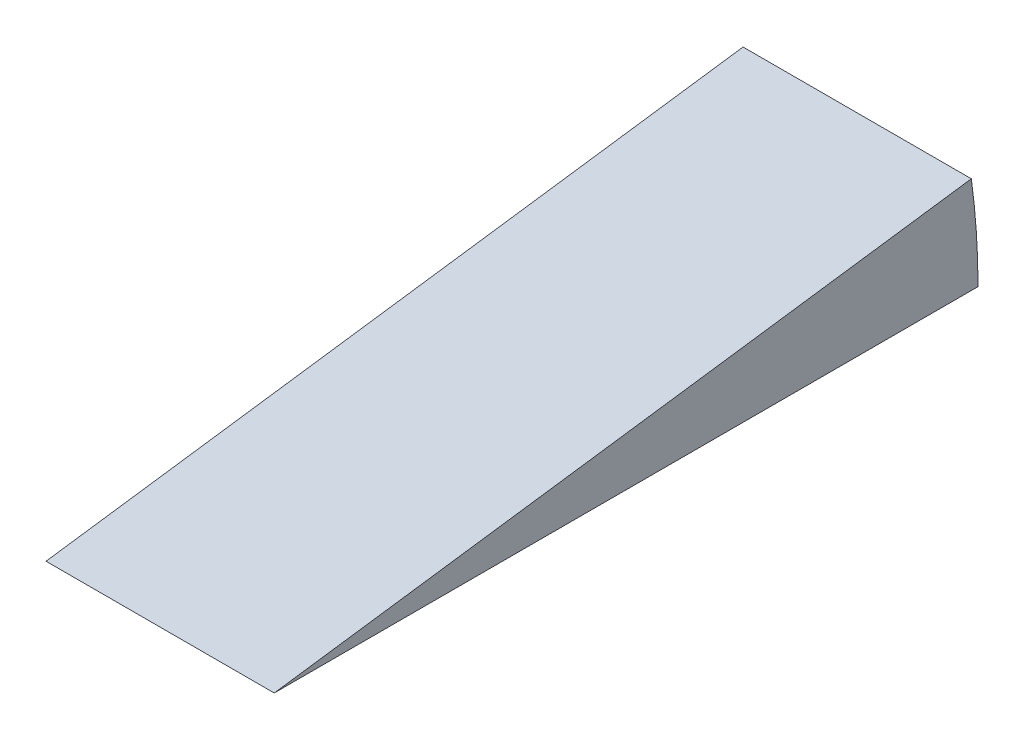
ISO-10303-21;
HEADER;
FILE_DESCRIPTION(('STEP AP214'),'2;1');
FILE_NAME('part.step','',(''),(''),'','','');
FILE_SCHEMA(('AUTOMOTIVE_DESIGN { 1 0 10303 214 1 1 1 1 }'));
ENDSEC;
DATA;
#1=APPLICATION_CONTEXT('core data for automotive mechanical design processes');
#2=APPLICATION_PROTOCOL_DEFINITION('international standard','automotive_design',2000,#1);
#3=PRODUCT_CONTEXT('',#1,'mechanical');
#4=PRODUCT('Part','Part','',(#3));
#5=PRODUCT_RELATED_PRODUCT_CATEGORY('part','',(#4));
#6=PRODUCT_DEFINITION_FORMATION('','',#4);
#7=PRODUCT_DEFINITION_CONTEXT('part definition',#1,'design');
#8=PRODUCT_DEFINITION('design','',#6,#7);
#9=PRODUCT_DEFINITION_SHAPE('','',#8);
#10=(LENGTH_UNIT() NAMED_UNIT(*) SI_UNIT(.MILLI.,.METRE.));
#11=(NAMED_UNIT(*) PLANE_ANGLE_UNIT() SI_UNIT($,.RADIAN.));
#12=(NAMED_UNIT(*) SI_UNIT($,.STERADIAN.) SOLID_ANGLE_UNIT());
#13=UNCERTAINTY_MEASURE_WITH_UNIT(LENGTH_MEASURE(1.E-05),#10,'distance_accuracy_value','');
#14=(GEOMETRIC_REPRESENTATION_CONTEXT(3) GLOBAL_UNCERTAINTY_ASSIGNED_CONTEXT((#13)) GLOBAL_UNIT_ASSIGNED_CONTEXT((#10,
#11,#12)) REPRESENTATION_CONTEXT('',''));
#15=CARTESIAN_POINT('',(0.,0.,0.));
#16=DIRECTION('',(0.,0.,1.));
#17=DIRECTION('',(1.,0.,0.));
#18=AXIS2_PLACEMENT_3D('',#15,#16,#17);
#19=CARTESIAN_POINT('',(0.,20.,-144.));
#20=DIRECTION('',(0.,-0.990492273177752,-0.137568371274688));
#21=DIRECTION('',(0.,0.137568371274688,-0.990492273177752));
#22=AXIS2_PLACEMENT_3D('',#19,#20,#21);
#23=PLANE('',#22);
#24=DIRECTION('',(0.,0.137568371274688,-0.990492273177752));
#25=VECTOR('',#24,1.);
#26=CARTESIAN_POINT('',(24.,20.,-144.));
#27=LINE('',#26,#25);
#28=CARTESIAN_POINT('',(24.,0.,0.));
#29=VERTEX_POINT('',#28);
#30=CARTESIAN_POINT('',(24.,10.1800594743269,-73.2964282151536));
#31=VERTEX_POINT('',#30);
#32=EDGE_CURVE('E72',#29,#31,#27,.T.);
#33=ORIENTED_EDGE('',*,*,#32,.T.);
#34=DIRECTION('',(-1.,0.,0.));
#35=VECTOR('',#34,1.);
#36=CARTESIAN_POINT('',(0.,10.1800594743269,-73.2964282151536));
#37=LINE('',#36,#35);
#38=CARTESIAN_POINT('',(0.,10.1800594743269,-73.2964282151536));
#39=VERTEX_POINT('',#38);
#40=EDGE_CURVE('E11',#31,#39,#37,.T.);
#41=ORIENTED_EDGE('',*,*,#40,.T.);
#42=DIRECTION('',(0.,0.137568371274688,-0.990492273177752));
#43=VECTOR('',#42,1.);
#44=CARTESIAN_POINT('',(0.,20.,-144.));
#45=LINE('',#44,#43);
#46=CARTESIAN_POINT('',(0.,0.,0.));
#47=VERTEX_POINT('',#46);
#48=EDGE_CURVE('E74',#47,#39,#45,.T.);
#49=ORIENTED_EDGE('',*,*,#48,.F.);
#50=DIRECTION('',(1.,0.,0.));
#51=VECTOR('',#50,1.);
#52=CARTESIAN_POINT('',(0.,0.,0.));
#53=LINE('',#52,#51);
#54=EDGE_CURVE('E78',#47,#29,#53,.T.);
#55=ORIENTED_EDGE('',*,*,#54,.T.);
#56=EDGE_LOOP('',(#33,#41,#49,#55));
#57=FACE_BOUND('',#56,.T.);
#58=ADVANCED_FACE('F32',(#57),#23,.F.);
#59=CARTESIAN_POINT('',(0.,0.,0.));
#60=DIRECTION('',(0.,-1.,0.));
#61=DIRECTION('',(0.,0.,-1.));
#62=AXIS2_PLACEMENT_3D('',#59,#60,#61);
#63=PLANE('',#62);
#64=DIRECTION('',(-1.,0.,0.));
#65=VECTOR('',#64,1.);
#66=CARTESIAN_POINT('',(0.,0.,-74.));
#67=LINE('',#66,#65);
#68=CARTESIAN_POINT('',(24.,0.,-74.));
#69=VERTEX_POINT('',#68);
#70=CARTESIAN_POINT('',(0.,0.,-74.));
#71=VERTEX_POINT('',#70);
#72=EDGE_CURVE('E65',#69,#71,#67,.T.);
#73=ORIENTED_EDGE('',*,*,#72,.F.);
#74=DIRECTION('',(0.,0.,-1.));
#75=VECTOR('',#74,1.);
#76=CARTESIAN_POINT('',(24.,0.,0.));
#77=LINE('',#76,#75);
#78=EDGE_CURVE('E40',#29,#69,#77,.T.);
#79=ORIENTED_EDGE('',*,*,#78,.F.);
#80=ORIENTED_EDGE('',*,*,#54,.F.);
#81=DIRECTION('',(0.,0.,1.));
#82=VECTOR('',#81,1.);
#83=CARTESIAN_POINT('',(0.,0.,0.));
#84=LINE('',#83,#82);
#85=EDGE_CURVE('E53',#71,#47,#84,.T.);
#86=ORIENTED_EDGE('',*,*,#85,.F.);
#87=EDGE_LOOP('',(#73,#79,#80,#86));
#88=FACE_BOUND('',#87,.T.);
#89=ADVANCED_FACE('F77',(#88),#63,.T.);
#90=CARTESIAN_POINT('',(24.,20.,0.));
#91=DIRECTION('',(-1.,0.,0.));
#92=DIRECTION('',(0.,0.,1.));
#93=AXIS2_PLACEMENT_3D('',#90,#91,#92);
#94=PLANE('',#93);
#95=ORIENTED_EDGE('',*,*,#78,.T.);
#96=CARTESIAN_POINT('',(24.,0.,0.));
#97=DIRECTION('',(-1.,0.,0.));
#98=DIRECTION('',(0.,0.,1.));
#99=AXIS2_PLACEMENT_3D('',#96,#97,#98);
#100=CIRCLE('',#99,74.);
#101=EDGE_CURVE('E68',#31,#69,#100,.T.);
#102=ORIENTED_EDGE('',*,*,#101,.F.);
#103=ORIENTED_EDGE('',*,*,#32,.F.);
#104=EDGE_LOOP('',(#95,#102,#103));
#105=FACE_BOUND('',#104,.T.);
#106=ADVANCED_FACE('F85',(#105),#94,.F.);
#107=CARTESIAN_POINT('',(0.,20.,0.));
#108=DIRECTION('',(1.,0.,0.));
#109=DIRECTION('',(0.,0.,-1.));
#110=AXIS2_PLACEMENT_3D('',#107,#108,#109);
#111=PLANE('',#110);
#112=ORIENTED_EDGE('',*,*,#48,.T.);
#113=CARTESIAN_POINT('',(0.,0.,0.));
#114=DIRECTION('',(-1.,0.,0.));
#115=DIRECTION('',(0.,0.,1.));
#116=AXIS2_PLACEMENT_3D('',#113,#114,#115);
#117=CIRCLE('',#116,74.);
#118=EDGE_CURVE('E47',#39,#71,#117,.T.);
#119=ORIENTED_EDGE('',*,*,#118,.T.);
#120=ORIENTED_EDGE('',*,*,#85,.T.);
#121=EDGE_LOOP('',(#112,#119,#120));
#122=FACE_BOUND('',#121,.T.);
#123=ADVANCED_FACE('F34',(#122),#111,.F.);
#124=CARTESIAN_POINT('',(0.,0.,0.));
#125=DIRECTION('',(-1.,0.,0.));
#126=DIRECTION('',(0.,0.,1.));
#127=AXIS2_PLACEMENT_3D('',#124,#125,#126);
#128=CYLINDRICAL_SURFACE('',#127,74.);
#129=ORIENTED_EDGE('',*,*,#72,.T.);
#130=ORIENTED_EDGE('',*,*,#118,.F.);
#131=ORIENTED_EDGE('',*,*,#40,.F.);
#132=ORIENTED_EDGE('',*,*,#101,.T.);
#133=EDGE_LOOP('',(#129,#130,#131,#132));
#134=FACE_BOUND('',#133,.T.);
#135=ADVANCED_FACE('F66',(#134),#128,.T.);
#136=CLOSED_SHELL('',(#58,#89,#106,#123,#135));
#137=MANIFOLD_SOLID_BREP('B2',#136);
#138=ADVANCED_BREP_SHAPE_REPRESENTATION('',(#18,#137),#14);
#139=SHAPE_DEFINITION_REPRESENTATION(#9,#138);
ENDSEC;
END-ISO-10303-21;
